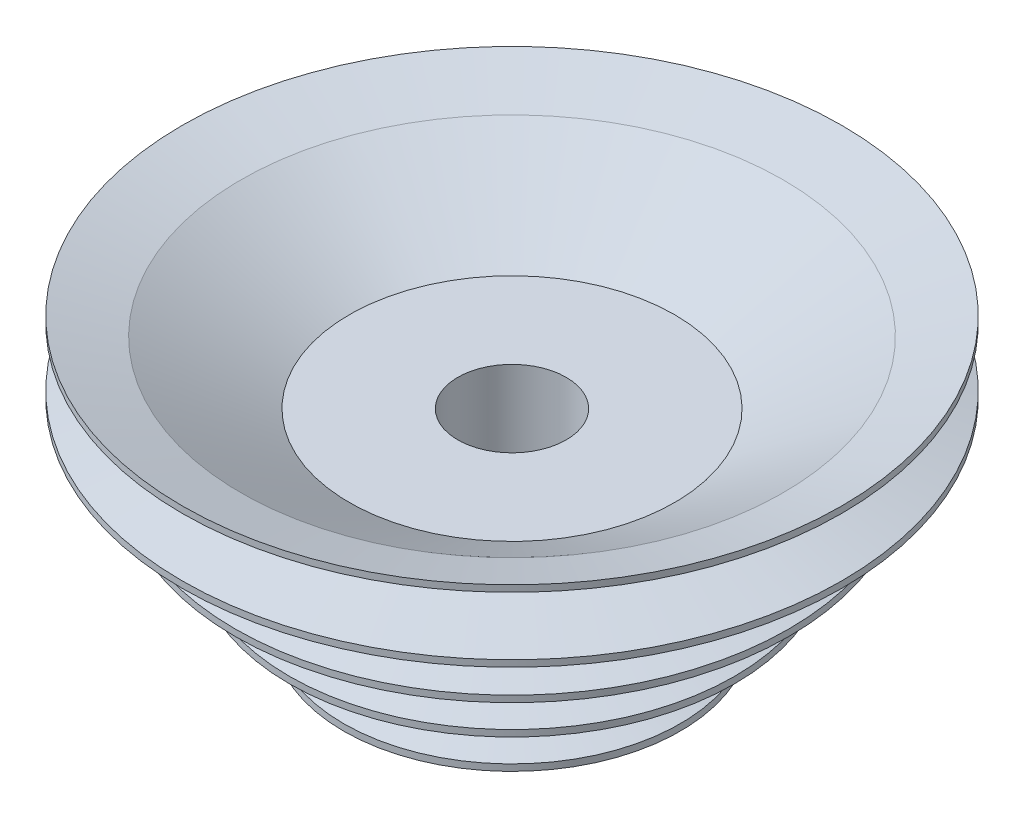
ISO-10303-21;
HEADER;
FILE_DESCRIPTION(('STEP AP214'),'2;1');
FILE_NAME('part.step','',(''),(''),'','','');
FILE_SCHEMA(('AUTOMOTIVE_DESIGN { 1 0 10303 214 1 1 1 1 }'));
ENDSEC;
DATA;
#1=APPLICATION_CONTEXT('core data for automotive mechanical design processes');
#2=APPLICATION_PROTOCOL_DEFINITION('international standard','automotive_design',2000,#1);
#3=PRODUCT_CONTEXT('',#1,'mechanical');
#4=PRODUCT('Part','Part','',(#3));
#5=PRODUCT_RELATED_PRODUCT_CATEGORY('part','',(#4));
#6=PRODUCT_DEFINITION_FORMATION('','',#4);
#7=PRODUCT_DEFINITION_CONTEXT('part definition',#1,'design');
#8=PRODUCT_DEFINITION('design','',#6,#7);
#9=PRODUCT_DEFINITION_SHAPE('','',#8);
#10=(LENGTH_UNIT() NAMED_UNIT(*) SI_UNIT(.MILLI.,.METRE.));
#11=(NAMED_UNIT(*) PLANE_ANGLE_UNIT() SI_UNIT($,.RADIAN.));
#12=(NAMED_UNIT(*) SI_UNIT($,.STERADIAN.) SOLID_ANGLE_UNIT());
#13=UNCERTAINTY_MEASURE_WITH_UNIT(LENGTH_MEASURE(1.E-05),#10,'distance_accuracy_value','');
#14=(GEOMETRIC_REPRESENTATION_CONTEXT(3) GLOBAL_UNCERTAINTY_ASSIGNED_CONTEXT((#13)) GLOBAL_UNIT_ASSIGNED_CONTEXT((#10,
#11,#12)) REPRESENTATION_CONTEXT('',''));
#15=CARTESIAN_POINT('',(0.,0.,0.));
#16=DIRECTION('',(0.,0.,1.));
#17=DIRECTION('',(1.,0.,0.));
#18=AXIS2_PLACEMENT_3D('',#15,#16,#17);
#19=CARTESIAN_POINT('',(0.,45.,0.));
#20=DIRECTION('',(0.,1.,0.));
#21=DIRECTION('',(0.,0.,1.));
#22=AXIS2_PLACEMENT_3D('',#19,#20,#21);
#23=CONICAL_SURFACE('',#22,37.5,1.0471975511966);
#24=CARTESIAN_POINT('',(0.,59.4337567297405,0.));
#25=DIRECTION('',(0.,-1.,0.));
#26=DIRECTION('',(0.,0.,-1.));
#27=AXIS2_PLACEMENT_3D('',#24,#25,#26);
#28=CIRCLE('',#27,62.5);
#29=CARTESIAN_POINT('',(0.,59.4337567297405,-62.5));
#30=VERTEX_POINT('',#29);
#31=EDGE_CURVE('E121',#30,#30,#28,.T.);
#32=ORIENTED_EDGE('',*,*,#31,.F.);
#33=EDGE_LOOP('',(#32));
#34=FACE_BOUND('',#33,.T.);
#35=CARTESIAN_POINT('',(0.,45.,0.));
#36=DIRECTION('',(0.,-1.,0.));
#37=DIRECTION('',(0.,0.,-1.));
#38=AXIS2_PLACEMENT_3D('',#35,#36,#37);
#39=CIRCLE('',#38,37.5);
#40=CARTESIAN_POINT('',(0.,45.,-37.5));
#41=VERTEX_POINT('',#40);
#42=EDGE_CURVE('E10',#41,#41,#39,.T.);
#43=ORIENTED_EDGE('',*,*,#42,.T.);
#44=EDGE_LOOP('',(#43));
#45=FACE_BOUND('',#44,.T.);
#46=ADVANCED_FACE('F33',(#34,#45),#23,.F.);
#47=CARTESIAN_POINT('',(0.,45.,0.));
#48=DIRECTION('',(0.,-1.,0.));
#49=DIRECTION('',(0.,0.,-1.));
#50=AXIS2_PLACEMENT_3D('',#47,#48,#49);
#51=PLANE('',#50);
#52=ORIENTED_EDGE('',*,*,#42,.F.);
#53=EDGE_LOOP('',(#52));
#54=FACE_BOUND('',#53,.T.);
#55=CARTESIAN_POINT('',(0.,45.,0.));
#56=DIRECTION('',(0.,-1.,0.));
#57=DIRECTION('',(0.,0.,-1.));
#58=AXIS2_PLACEMENT_3D('',#55,#56,#57);
#59=CIRCLE('',#58,12.5);
#60=CARTESIAN_POINT('',(0.,45.,-12.5));
#61=VERTEX_POINT('',#60);
#62=EDGE_CURVE('E39',#61,#61,#59,.T.);
#63=ORIENTED_EDGE('',*,*,#62,.T.);
#64=EDGE_LOOP('',(#63));
#65=FACE_BOUND('',#64,.T.);
#66=ADVANCED_FACE('F129',(#54,#65),#51,.F.);
#67=CARTESIAN_POINT('',(0.,0.,0.));
#68=DIRECTION('',(0.,-1.,0.));
#69=DIRECTION('',(0.,0.,-1.));
#70=AXIS2_PLACEMENT_3D('',#67,#68,#69);
#71=CYLINDRICAL_SURFACE('',#70,12.5);
#72=ORIENTED_EDGE('',*,*,#62,.F.);
#73=EDGE_LOOP('',(#72));
#74=FACE_BOUND('',#73,.T.);
#75=CARTESIAN_POINT('',(0.,0.,0.));
#76=DIRECTION('',(0.,-1.,0.));
#77=DIRECTION('',(0.,0.,-1.));
#78=AXIS2_PLACEMENT_3D('',#75,#76,#77);
#79=CIRCLE('',#78,12.5);
#80=CARTESIAN_POINT('',(0.,0.,-12.5));
#81=VERTEX_POINT('',#80);
#82=EDGE_CURVE('E43',#81,#81,#79,.T.);
#83=ORIENTED_EDGE('',*,*,#82,.T.);
#84=EDGE_LOOP('',(#83));
#85=FACE_BOUND('',#84,.T.);
#86=ADVANCED_FACE('F133',(#74,#85),#71,.F.);
#87=CARTESIAN_POINT('',(0.,0.,0.));
#88=DIRECTION('',(0.,-1.,0.));
#89=DIRECTION('',(0.,0.,-1.));
#90=AXIS2_PLACEMENT_3D('',#87,#88,#89);
#91=PLANE('',#90);
#92=CARTESIAN_POINT('',(0.,0.,0.));
#93=DIRECTION('',(0.,-1.,0.));
#94=DIRECTION('',(0.,0.,-1.));
#95=AXIS2_PLACEMENT_3D('',#92,#93,#94);
#96=CIRCLE('',#95,38.8);
#97=CARTESIAN_POINT('',(0.,0.,-38.8));
#98=VERTEX_POINT('',#97);
#99=EDGE_CURVE('E47',#98,#98,#96,.T.);
#100=ORIENTED_EDGE('',*,*,#99,.T.);
#101=EDGE_LOOP('',(#100));
#102=FACE_BOUND('',#101,.T.);
#103=ORIENTED_EDGE('',*,*,#82,.F.);
#104=EDGE_LOOP('',(#103));
#105=FACE_BOUND('',#104,.T.);
#106=ADVANCED_FACE('F138',(#102,#105),#91,.T.);
#107=CARTESIAN_POINT('',(0.,0.,0.));
#108=DIRECTION('',(0.,-1.,0.));
#109=DIRECTION('',(0.,0.,-1.));
#110=AXIS2_PLACEMENT_3D('',#107,#108,#109);
#111=CYLINDRICAL_SURFACE('',#110,38.8);
#112=CARTESIAN_POINT('',(0.,1.5,0.));
#113=DIRECTION('',(0.,-1.,0.));
#114=DIRECTION('',(0.,0.,-1.));
#115=AXIS2_PLACEMENT_3D('',#112,#113,#114);
#116=CIRCLE('',#115,38.8);
#117=CARTESIAN_POINT('',(0.,1.5,-38.8));
#118=VERTEX_POINT('',#117);
#119=EDGE_CURVE('E52',#118,#118,#116,.T.);
#120=ORIENTED_EDGE('',*,*,#119,.T.);
#121=EDGE_LOOP('',(#120));
#122=FACE_BOUND('',#121,.T.);
#123=ORIENTED_EDGE('',*,*,#99,.F.);
#124=EDGE_LOOP('',(#123));
#125=FACE_BOUND('',#124,.T.);
#126=ADVANCED_FACE('F144',(#122,#125),#111,.T.);
#127=CARTESIAN_POINT('',(0.,1.5,0.));
#128=DIRECTION('',(0.,-1.,0.));
#129=DIRECTION('',(0.,0.,-1.));
#130=AXIS2_PLACEMENT_3D('',#127,#128,#129);
#131=CONICAL_SURFACE('',#130,38.8,1.27409035395587);
#132=CARTESIAN_POINT('',(0.,5.71908340412941,0.));
#133=DIRECTION('',(0.,-1.,0.));
#134=DIRECTION('',(0.,0.,-1.));
#135=AXIS2_PLACEMENT_3D('',#132,#133,#134);
#136=CIRCLE('',#135,25.);
#137=CARTESIAN_POINT('',(0.,5.71908340412941,-25.));
#138=VERTEX_POINT('',#137);
#139=EDGE_CURVE('E55',#138,#138,#136,.T.);
#140=ORIENTED_EDGE('',*,*,#139,.T.);
#141=EDGE_LOOP('',(#140));
#142=FACE_BOUND('',#141,.T.);
#143=ORIENTED_EDGE('',*,*,#119,.F.);
#144=EDGE_LOOP('',(#143));
#145=FACE_BOUND('',#144,.T.);
#146=ADVANCED_FACE('F148',(#142,#145),#131,.T.);
#147=CARTESIAN_POINT('',(0.,0.,0.));
#148=DIRECTION('',(0.,-1.,0.));
#149=DIRECTION('',(0.,0.,-1.));
#150=AXIS2_PLACEMENT_3D('',#147,#148,#149);
#151=CYLINDRICAL_SURFACE('',#150,25.);
#152=ORIENTED_EDGE('',*,*,#139,.F.);
#153=EDGE_LOOP('',(#152));
#154=FACE_BOUND('',#153,.T.);
#155=CARTESIAN_POINT('',(0.,9.98091659587041,0.));
#156=DIRECTION('',(0.,-1.,0.));
#157=DIRECTION('',(0.,0.,-1.));
#158=AXIS2_PLACEMENT_3D('',#155,#156,#157);
#159=CIRCLE('',#158,25.);
#160=CARTESIAN_POINT('',(0.,9.98091659587041,-25.));
#161=VERTEX_POINT('',#160);
#162=EDGE_CURVE('E58',#161,#161,#159,.T.);
#163=ORIENTED_EDGE('',*,*,#162,.T.);
#164=EDGE_LOOP('',(#163));
#165=FACE_BOUND('',#164,.T.);
#166=ADVANCED_FACE('F152',(#154,#165),#151,.T.);
#167=CARTESIAN_POINT('',(0.,14.2,0.));
#168=DIRECTION('',(0.,1.,0.));
#169=DIRECTION('',(0.,0.,1.));
#170=AXIS2_PLACEMENT_3D('',#167,#168,#169);
#171=CONICAL_SURFACE('',#170,38.8,1.27409035395586);
#172=ORIENTED_EDGE('',*,*,#162,.F.);
#173=EDGE_LOOP('',(#172));
#174=FACE_BOUND('',#173,.T.);
#175=CARTESIAN_POINT('',(0.,14.2,0.));
#176=DIRECTION('',(0.,-1.,0.));
#177=DIRECTION('',(0.,0.,-1.));
#178=AXIS2_PLACEMENT_3D('',#175,#176,#177);
#179=CIRCLE('',#178,38.8);
#180=CARTESIAN_POINT('',(0.,14.2,-38.8));
#181=VERTEX_POINT('',#180);
#182=EDGE_CURVE('E61',#181,#181,#179,.T.);
#183=ORIENTED_EDGE('',*,*,#182,.T.);
#184=EDGE_LOOP('',(#183));
#185=FACE_BOUND('',#184,.T.);
#186=ADVANCED_FACE('F156',(#174,#185),#171,.T.);
#187=CARTESIAN_POINT('',(0.,0.,0.));
#188=DIRECTION('',(0.,-1.,0.));
#189=DIRECTION('',(0.,0.,-1.));
#190=AXIS2_PLACEMENT_3D('',#187,#188,#189);
#191=CYLINDRICAL_SURFACE('',#190,38.8);
#192=CARTESIAN_POINT('',(0.,15.7,0.));
#193=DIRECTION('',(0.,-1.,0.));
#194=DIRECTION('',(0.,0.,-1.));
#195=AXIS2_PLACEMENT_3D('',#192,#193,#194);
#196=CIRCLE('',#195,38.8);
#197=CARTESIAN_POINT('',(0.,15.7,-38.8));
#198=VERTEX_POINT('',#197);
#199=EDGE_CURVE('E64',#198,#198,#196,.T.);
#200=ORIENTED_EDGE('',*,*,#199,.T.);
#201=EDGE_LOOP('',(#200));
#202=FACE_BOUND('',#201,.T.);
#203=ORIENTED_EDGE('',*,*,#182,.F.);
#204=EDGE_LOOP('',(#203));
#205=FACE_BOUND('',#204,.T.);
#206=ADVANCED_FACE('F160',(#202,#205),#191,.T.);
#207=CARTESIAN_POINT('',(0.,15.7,0.));
#208=DIRECTION('',(0.,-1.,0.));
#209=DIRECTION('',(0.,0.,-1.));
#210=AXIS2_PLACEMENT_3D('',#207,#208,#209);
#211=PLANE('',#210);
#212=CARTESIAN_POINT('',(0.,15.7,0.));
#213=DIRECTION('',(0.,-1.,0.));
#214=DIRECTION('',(0.,0.,-1.));
#215=AXIS2_PLACEMENT_3D('',#212,#213,#214);
#216=CIRCLE('',#215,51.3);
#217=CARTESIAN_POINT('',(0.,15.7,-51.3));
#218=VERTEX_POINT('',#217);
#219=EDGE_CURVE('E67',#218,#218,#216,.T.);
#220=ORIENTED_EDGE('',*,*,#219,.T.);
#221=EDGE_LOOP('',(#220));
#222=FACE_BOUND('',#221,.T.);
#223=ORIENTED_EDGE('',*,*,#199,.F.);
#224=EDGE_LOOP('',(#223));
#225=FACE_BOUND('',#224,.T.);
#226=ADVANCED_FACE('F164',(#222,#225),#211,.T.);
#227=CARTESIAN_POINT('',(0.,0.,0.));
#228=DIRECTION('',(0.,-1.,0.));
#229=DIRECTION('',(0.,0.,-1.));
#230=AXIS2_PLACEMENT_3D('',#227,#228,#229);
#231=CYLINDRICAL_SURFACE('',#230,51.3);
#232=CARTESIAN_POINT('',(0.,17.2,0.));
#233=DIRECTION('',(0.,-1.,0.));
#234=DIRECTION('',(0.,0.,-1.));
#235=AXIS2_PLACEMENT_3D('',#232,#233,#234);
#236=CIRCLE('',#235,51.3);
#237=CARTESIAN_POINT('',(0.,17.2,-51.3));
#238=VERTEX_POINT('',#237);
#239=EDGE_CURVE('E70',#238,#238,#236,.T.);
#240=ORIENTED_EDGE('',*,*,#239,.T.);
#241=EDGE_LOOP('',(#240));
#242=FACE_BOUND('',#241,.T.);
#243=ORIENTED_EDGE('',*,*,#219,.F.);
#244=EDGE_LOOP('',(#243));
#245=FACE_BOUND('',#244,.T.);
#246=ADVANCED_FACE('F168',(#242,#245),#231,.T.);
#247=CARTESIAN_POINT('',(0.,17.2,0.));
#248=DIRECTION('',(0.,-1.,0.));
#249=DIRECTION('',(0.,0.,-1.));
#250=AXIS2_PLACEMENT_3D('',#247,#248,#249);
#251=CONICAL_SURFACE('',#250,51.3,1.27409035395587);
#252=CARTESIAN_POINT('',(0.,21.4190834041294,0.));
#253=DIRECTION('',(0.,-1.,0.));
#254=DIRECTION('',(0.,0.,-1.));
#255=AXIS2_PLACEMENT_3D('',#252,#253,#254);
#256=CIRCLE('',#255,37.5);
#257=CARTESIAN_POINT('',(0.,21.4190834041294,-37.5));
#258=VERTEX_POINT('',#257);
#259=EDGE_CURVE('E73',#258,#258,#256,.T.);
#260=ORIENTED_EDGE('',*,*,#259,.T.);
#261=EDGE_LOOP('',(#260));
#262=FACE_BOUND('',#261,.T.);
#263=ORIENTED_EDGE('',*,*,#239,.F.);
#264=EDGE_LOOP('',(#263));
#265=FACE_BOUND('',#264,.T.);
#266=ADVANCED_FACE('F172',(#262,#265),#251,.T.);
#267=CARTESIAN_POINT('',(0.,0.,0.));
#268=DIRECTION('',(0.,-1.,0.));
#269=DIRECTION('',(0.,0.,-1.));
#270=AXIS2_PLACEMENT_3D('',#267,#268,#269);
#271=CYLINDRICAL_SURFACE('',#270,37.5);
#272=ORIENTED_EDGE('',*,*,#259,.F.);
#273=EDGE_LOOP('',(#272));
#274=FACE_BOUND('',#273,.T.);
#275=CARTESIAN_POINT('',(0.,25.6809165958704,0.));
#276=DIRECTION('',(0.,-1.,0.));
#277=DIRECTION('',(0.,0.,-1.));
#278=AXIS2_PLACEMENT_3D('',#275,#276,#277);
#279=CIRCLE('',#278,37.5);
#280=CARTESIAN_POINT('',(0.,25.6809165958704,-37.5));
#281=VERTEX_POINT('',#280);
#282=EDGE_CURVE('E76',#281,#281,#279,.T.);
#283=ORIENTED_EDGE('',*,*,#282,.T.);
#284=EDGE_LOOP('',(#283));
#285=FACE_BOUND('',#284,.T.);
#286=ADVANCED_FACE('F176',(#274,#285),#271,.T.);
#287=CARTESIAN_POINT('',(0.,29.9,0.));
#288=DIRECTION('',(0.,1.,0.));
#289=DIRECTION('',(0.,0.,1.));
#290=AXIS2_PLACEMENT_3D('',#287,#288,#289);
#291=CONICAL_SURFACE('',#290,51.3,1.27409035395586);
#292=ORIENTED_EDGE('',*,*,#282,.F.);
#293=EDGE_LOOP('',(#292));
#294=FACE_BOUND('',#293,.T.);
#295=CARTESIAN_POINT('',(0.,29.9,0.));
#296=DIRECTION('',(0.,-1.,0.));
#297=DIRECTION('',(0.,0.,-1.));
#298=AXIS2_PLACEMENT_3D('',#295,#296,#297);
#299=CIRCLE('',#298,51.3);
#300=CARTESIAN_POINT('',(0.,29.9,-51.3));
#301=VERTEX_POINT('',#300);
#302=EDGE_CURVE('E79',#301,#301,#299,.T.);
#303=ORIENTED_EDGE('',*,*,#302,.T.);
#304=EDGE_LOOP('',(#303));
#305=FACE_BOUND('',#304,.T.);
#306=ADVANCED_FACE('F180',(#294,#305),#291,.T.);
#307=CARTESIAN_POINT('',(0.,0.,0.));
#308=DIRECTION('',(0.,-1.,0.));
#309=DIRECTION('',(0.,0.,-1.));
#310=AXIS2_PLACEMENT_3D('',#307,#308,#309);
#311=CYLINDRICAL_SURFACE('',#310,51.3);
#312=CARTESIAN_POINT('',(0.,31.4,0.));
#313=DIRECTION('',(0.,-1.,0.));
#314=DIRECTION('',(0.,0.,-1.));
#315=AXIS2_PLACEMENT_3D('',#312,#313,#314);
#316=CIRCLE('',#315,51.3);
#317=CARTESIAN_POINT('',(0.,31.4,-51.3));
#318=VERTEX_POINT('',#317);
#319=EDGE_CURVE('E82',#318,#318,#316,.T.);
#320=ORIENTED_EDGE('',*,*,#319,.T.);
#321=EDGE_LOOP('',(#320));
#322=FACE_BOUND('',#321,.T.);
#323=ORIENTED_EDGE('',*,*,#302,.F.);
#324=EDGE_LOOP('',(#323));
#325=FACE_BOUND('',#324,.T.);
#326=ADVANCED_FACE('F184',(#322,#325),#311,.T.);
#327=CARTESIAN_POINT('',(0.,31.4,0.));
#328=DIRECTION('',(0.,-1.,0.));
#329=DIRECTION('',(0.,0.,-1.));
#330=AXIS2_PLACEMENT_3D('',#327,#328,#329);
#331=PLANE('',#330);
#332=CARTESIAN_POINT('',(0.,31.4,0.));
#333=DIRECTION('',(0.,-1.,0.));
#334=DIRECTION('',(0.,0.,-1.));
#335=AXIS2_PLACEMENT_3D('',#332,#333,#334);
#336=CIRCLE('',#335,63.8);
#337=CARTESIAN_POINT('',(0.,31.4,-63.8));
#338=VERTEX_POINT('',#337);
#339=EDGE_CURVE('E85',#338,#338,#336,.T.);
#340=ORIENTED_EDGE('',*,*,#339,.T.);
#341=EDGE_LOOP('',(#340));
#342=FACE_BOUND('',#341,.T.);
#343=ORIENTED_EDGE('',*,*,#319,.F.);
#344=EDGE_LOOP('',(#343));
#345=FACE_BOUND('',#344,.T.);
#346=ADVANCED_FACE('F188',(#342,#345),#331,.T.);
#347=CARTESIAN_POINT('',(0.,0.,0.));
#348=DIRECTION('',(0.,-1.,0.));
#349=DIRECTION('',(0.,0.,-1.));
#350=AXIS2_PLACEMENT_3D('',#347,#348,#349);
#351=CYLINDRICAL_SURFACE('',#350,63.8);
#352=CARTESIAN_POINT('',(0.,32.8999999999998,0.));
#353=DIRECTION('',(0.,-1.,0.));
#354=DIRECTION('',(0.,0.,-1.));
#355=AXIS2_PLACEMENT_3D('',#352,#353,#354);
#356=CIRCLE('',#355,63.8);
#357=CARTESIAN_POINT('',(0.,32.8999999999998,-63.8));
#358=VERTEX_POINT('',#357);
#359=EDGE_CURVE('E88',#358,#358,#356,.T.);
#360=ORIENTED_EDGE('',*,*,#359,.T.);
#361=EDGE_LOOP('',(#360));
#362=FACE_BOUND('',#361,.T.);
#363=ORIENTED_EDGE('',*,*,#339,.F.);
#364=EDGE_LOOP('',(#363));
#365=FACE_BOUND('',#364,.T.);
#366=ADVANCED_FACE('F192',(#362,#365),#351,.T.);
#367=CARTESIAN_POINT('',(0.,32.8999999999998,0.));
#368=DIRECTION('',(0.,-1.,0.));
#369=DIRECTION('',(0.,0.,-1.));
#370=AXIS2_PLACEMENT_3D('',#367,#368,#369);
#371=CONICAL_SURFACE('',#370,63.8,1.27409035395587);
#372=CARTESIAN_POINT('',(0.,37.1190834041293,0.));
#373=DIRECTION('',(0.,-1.,0.));
#374=DIRECTION('',(0.,0.,-1.));
#375=AXIS2_PLACEMENT_3D('',#372,#373,#374);
#376=CIRCLE('',#375,50.);
#377=CARTESIAN_POINT('',(0.,37.1190834041293,-50.));
#378=VERTEX_POINT('',#377);
#379=EDGE_CURVE('E91',#378,#378,#376,.T.);
#380=ORIENTED_EDGE('',*,*,#379,.T.);
#381=EDGE_LOOP('',(#380));
#382=FACE_BOUND('',#381,.T.);
#383=ORIENTED_EDGE('',*,*,#359,.F.);
#384=EDGE_LOOP('',(#383));
#385=FACE_BOUND('',#384,.T.);
#386=ADVANCED_FACE('F196',(#382,#385),#371,.T.);
#387=CARTESIAN_POINT('',(0.,0.,0.));
#388=DIRECTION('',(0.,-1.,0.));
#389=DIRECTION('',(0.,0.,-1.));
#390=AXIS2_PLACEMENT_3D('',#387,#388,#389);
#391=CYLINDRICAL_SURFACE('',#390,50.);
#392=ORIENTED_EDGE('',*,*,#379,.F.);
#393=EDGE_LOOP('',(#392));
#394=FACE_BOUND('',#393,.T.);
#395=CARTESIAN_POINT('',(0.,41.3809165958704,0.));
#396=DIRECTION('',(0.,-1.,0.));
#397=DIRECTION('',(0.,0.,-1.));
#398=AXIS2_PLACEMENT_3D('',#395,#396,#397);
#399=CIRCLE('',#398,50.);
#400=CARTESIAN_POINT('',(0.,41.3809165958704,-50.));
#401=VERTEX_POINT('',#400);
#402=EDGE_CURVE('E94',#401,#401,#399,.T.);
#403=ORIENTED_EDGE('',*,*,#402,.T.);
#404=EDGE_LOOP('',(#403));
#405=FACE_BOUND('',#404,.T.);
#406=ADVANCED_FACE('F200',(#394,#405),#391,.T.);
#407=CARTESIAN_POINT('',(0.,41.3809165958704,0.));
#408=DIRECTION('',(0.,1.,0.));
#409=DIRECTION('',(0.,0.,1.));
#410=AXIS2_PLACEMENT_3D('',#407,#408,#409);
#411=CONICAL_SURFACE('',#410,50.,1.27409035395589);
#412=CARTESIAN_POINT('',(0.,45.5999999999996,0.));
#413=DIRECTION('',(0.,-1.,0.));
#414=DIRECTION('',(0.,0.,-1.));
#415=AXIS2_PLACEMENT_3D('',#412,#413,#414);
#416=CIRCLE('',#415,63.8000000000001);
#417=CARTESIAN_POINT('',(0.,45.5999999999996,-63.8000000000001));
#418=VERTEX_POINT('',#417);
#419=EDGE_CURVE('E97',#418,#418,#416,.T.);
#420=ORIENTED_EDGE('',*,*,#419,.T.);
#421=EDGE_LOOP('',(#420));
#422=FACE_BOUND('',#421,.T.);
#423=ORIENTED_EDGE('',*,*,#402,.F.);
#424=EDGE_LOOP('',(#423));
#425=FACE_BOUND('',#424,.T.);
#426=ADVANCED_FACE('F204',(#422,#425),#411,.T.);
#427=CARTESIAN_POINT('',(0.,0.,0.));
#428=DIRECTION('',(0.,-1.,0.));
#429=DIRECTION('',(0.,0.,-1.));
#430=AXIS2_PLACEMENT_3D('',#427,#428,#429);
#431=CYLINDRICAL_SURFACE('',#430,63.8000000000001);
#432=CARTESIAN_POINT('',(0.,47.0999999999996,0.));
#433=DIRECTION('',(0.,-1.,0.));
#434=DIRECTION('',(0.,0.,-1.));
#435=AXIS2_PLACEMENT_3D('',#432,#433,#434);
#436=CIRCLE('',#435,63.8000000000001);
#437=CARTESIAN_POINT('',(0.,47.0999999999996,-63.8000000000001));
#438=VERTEX_POINT('',#437);
#439=EDGE_CURVE('E100',#438,#438,#436,.T.);
#440=ORIENTED_EDGE('',*,*,#439,.T.);
#441=EDGE_LOOP('',(#440));
#442=FACE_BOUND('',#441,.T.);
#443=ORIENTED_EDGE('',*,*,#419,.F.);
#444=EDGE_LOOP('',(#443));
#445=FACE_BOUND('',#444,.T.);
#446=ADVANCED_FACE('F208',(#442,#445),#431,.T.);
#447=CARTESIAN_POINT('',(0.,47.0999999999996,0.));
#448=DIRECTION('',(0.,-1.,0.));
#449=DIRECTION('',(0.,0.,-1.));
#450=AXIS2_PLACEMENT_3D('',#447,#448,#449);
#451=PLANE('',#450);
#452=CARTESIAN_POINT('',(0.,47.0999999999996,0.));
#453=DIRECTION('',(0.,-1.,0.));
#454=DIRECTION('',(0.,0.,-1.));
#455=AXIS2_PLACEMENT_3D('',#452,#453,#454);
#456=CIRCLE('',#455,76.);
#457=CARTESIAN_POINT('',(0.,47.0999999999996,-76.));
#458=VERTEX_POINT('',#457);
#459=EDGE_CURVE('E103',#458,#458,#456,.T.);
#460=ORIENTED_EDGE('',*,*,#459,.T.);
#461=EDGE_LOOP('',(#460));
#462=FACE_BOUND('',#461,.T.);
#463=ORIENTED_EDGE('',*,*,#439,.F.);
#464=EDGE_LOOP('',(#463));
#465=FACE_BOUND('',#464,.T.);
#466=ADVANCED_FACE('F212',(#462,#465),#451,.T.);
#467=CARTESIAN_POINT('',(0.,0.,0.));
#468=DIRECTION('',(0.,-1.,0.));
#469=DIRECTION('',(0.,0.,-1.));
#470=AXIS2_PLACEMENT_3D('',#467,#468,#469);
#471=CYLINDRICAL_SURFACE('',#470,76.);
#472=CARTESIAN_POINT('',(0.,48.5999999999996,0.));
#473=DIRECTION('',(0.,-1.,0.));
#474=DIRECTION('',(0.,0.,-1.));
#475=AXIS2_PLACEMENT_3D('',#472,#473,#474);
#476=CIRCLE('',#475,76.);
#477=CARTESIAN_POINT('',(0.,48.5999999999996,-76.));
#478=VERTEX_POINT('',#477);
#479=EDGE_CURVE('E106',#478,#478,#476,.T.);
#480=ORIENTED_EDGE('',*,*,#479,.T.);
#481=EDGE_LOOP('',(#480));
#482=FACE_BOUND('',#481,.T.);
#483=ORIENTED_EDGE('',*,*,#459,.F.);
#484=EDGE_LOOP('',(#483));
#485=FACE_BOUND('',#484,.T.);
#486=ADVANCED_FACE('F216',(#482,#485),#471,.T.);
#487=CARTESIAN_POINT('',(0.,48.5999999999996,0.));
#488=DIRECTION('',(0.,-1.,0.));
#489=DIRECTION('',(0.,0.,-1.));
#490=AXIS2_PLACEMENT_3D('',#487,#488,#489);
#491=CONICAL_SURFACE('',#490,76.,1.27409035395588);
#492=CARTESIAN_POINT('',(0.,52.7273641996913,0.));
#493=DIRECTION('',(0.,-1.,0.));
#494=DIRECTION('',(0.,0.,-1.));
#495=AXIS2_PLACEMENT_3D('',#492,#493,#494);
#496=CIRCLE('',#495,62.5);
#497=CARTESIAN_POINT('',(0.,52.7273641996913,-62.5));
#498=VERTEX_POINT('',#497);
#499=EDGE_CURVE('E109',#498,#498,#496,.T.);
#500=ORIENTED_EDGE('',*,*,#499,.T.);
#501=EDGE_LOOP('',(#500));
#502=FACE_BOUND('',#501,.T.);
#503=ORIENTED_EDGE('',*,*,#479,.F.);
#504=EDGE_LOOP('',(#503));
#505=FACE_BOUND('',#504,.T.);
#506=ADVANCED_FACE('F220',(#502,#505),#491,.T.);
#507=CARTESIAN_POINT('',(0.,0.,0.));
#508=DIRECTION('',(0.,-1.,0.));
#509=DIRECTION('',(0.,0.,-1.));
#510=AXIS2_PLACEMENT_3D('',#507,#508,#509);
#511=CYLINDRICAL_SURFACE('',#510,62.5);
#512=ORIENTED_EDGE('',*,*,#499,.F.);
#513=EDGE_LOOP('',(#512));
#514=FACE_BOUND('',#513,.T.);
#515=CARTESIAN_POINT('',(0.,57.9337567297404,0.));
#516=DIRECTION('',(0.,-1.,0.));
#517=DIRECTION('',(0.,0.,-1.));
#518=AXIS2_PLACEMENT_3D('',#515,#516,#517);
#519=CIRCLE('',#518,62.5);
#520=CARTESIAN_POINT('',(0.,57.9337567297404,-62.5));
#521=VERTEX_POINT('',#520);
#522=EDGE_CURVE('E112',#521,#521,#519,.T.);
#523=ORIENTED_EDGE('',*,*,#522,.T.);
#524=EDGE_LOOP('',(#523));
#525=FACE_BOUND('',#524,.T.);
#526=ADVANCED_FACE('F224',(#514,#525),#511,.T.);
#527=CARTESIAN_POINT('',(0.,62.0611209294321,0.));
#528=DIRECTION('',(0.,1.,0.));
#529=DIRECTION('',(0.,0.,1.));
#530=AXIS2_PLACEMENT_3D('',#527,#528,#529);
#531=CONICAL_SURFACE('',#530,76.,1.27409035395587);
#532=ORIENTED_EDGE('',*,*,#522,.F.);
#533=EDGE_LOOP('',(#532));
#534=FACE_BOUND('',#533,.T.);
#535=CARTESIAN_POINT('',(0.,62.0611209294321,0.));
#536=DIRECTION('',(0.,-1.,0.));
#537=DIRECTION('',(0.,0.,-1.));
#538=AXIS2_PLACEMENT_3D('',#535,#536,#537);
#539=CIRCLE('',#538,76.);
#540=CARTESIAN_POINT('',(0.,62.0611209294321,-76.));
#541=VERTEX_POINT('',#540);
#542=EDGE_CURVE('E115',#541,#541,#539,.T.);
#543=ORIENTED_EDGE('',*,*,#542,.T.);
#544=EDGE_LOOP('',(#543));
#545=FACE_BOUND('',#544,.T.);
#546=ADVANCED_FACE('F228',(#534,#545),#531,.T.);
#547=CARTESIAN_POINT('',(0.,0.,0.));
#548=DIRECTION('',(0.,-1.,0.));
#549=DIRECTION('',(0.,0.,-1.));
#550=AXIS2_PLACEMENT_3D('',#547,#548,#549);
#551=CYLINDRICAL_SURFACE('',#550,76.);
#552=CARTESIAN_POINT('',(0.,63.5611209294322,0.));
#553=DIRECTION('',(0.,-1.,0.));
#554=DIRECTION('',(0.,0.,-1.));
#555=AXIS2_PLACEMENT_3D('',#552,#553,#554);
#556=CIRCLE('',#555,76.);
#557=CARTESIAN_POINT('',(0.,63.5611209294322,-76.));
#558=VERTEX_POINT('',#557);
#559=EDGE_CURVE('E118',#558,#558,#556,.T.);
#560=ORIENTED_EDGE('',*,*,#559,.T.);
#561=EDGE_LOOP('',(#560));
#562=FACE_BOUND('',#561,.T.);
#563=ORIENTED_EDGE('',*,*,#542,.F.);
#564=EDGE_LOOP('',(#563));
#565=FACE_BOUND('',#564,.T.);
#566=ADVANCED_FACE('F232',(#562,#565),#551,.T.);
#567=CARTESIAN_POINT('',(0.,63.5611209294322,0.));
#568=DIRECTION('',(0.,1.,0.));
#569=DIRECTION('',(0.,0.,1.));
#570=AXIS2_PLACEMENT_3D('',#567,#568,#569);
#571=CONICAL_SURFACE('',#570,76.,1.27409035395588);
#572=ORIENTED_EDGE('',*,*,#31,.T.);
#573=EDGE_LOOP('',(#572));
#574=FACE_BOUND('',#573,.T.);
#575=ORIENTED_EDGE('',*,*,#559,.F.);
#576=EDGE_LOOP('',(#575));
#577=FACE_BOUND('',#576,.T.);
#578=ADVANCED_FACE('F125',(#574,#577),#571,.F.);
#579=CLOSED_SHELL('',(#46,#66,#86,#106,#126,#146,#166,#186,#206,#226,#246,#266,#286,#306,#326,
#346,#366,#386,#406,#426,#446,#466,#486,#506,#526,#546,#566,#578));
#580=MANIFOLD_SOLID_BREP('B2',#579);
#581=ADVANCED_BREP_SHAPE_REPRESENTATION('',(#18,#580),#14);
#582=SHAPE_DEFINITION_REPRESENTATION(#9,#581);
ENDSEC;
END-ISO-10303-21;
